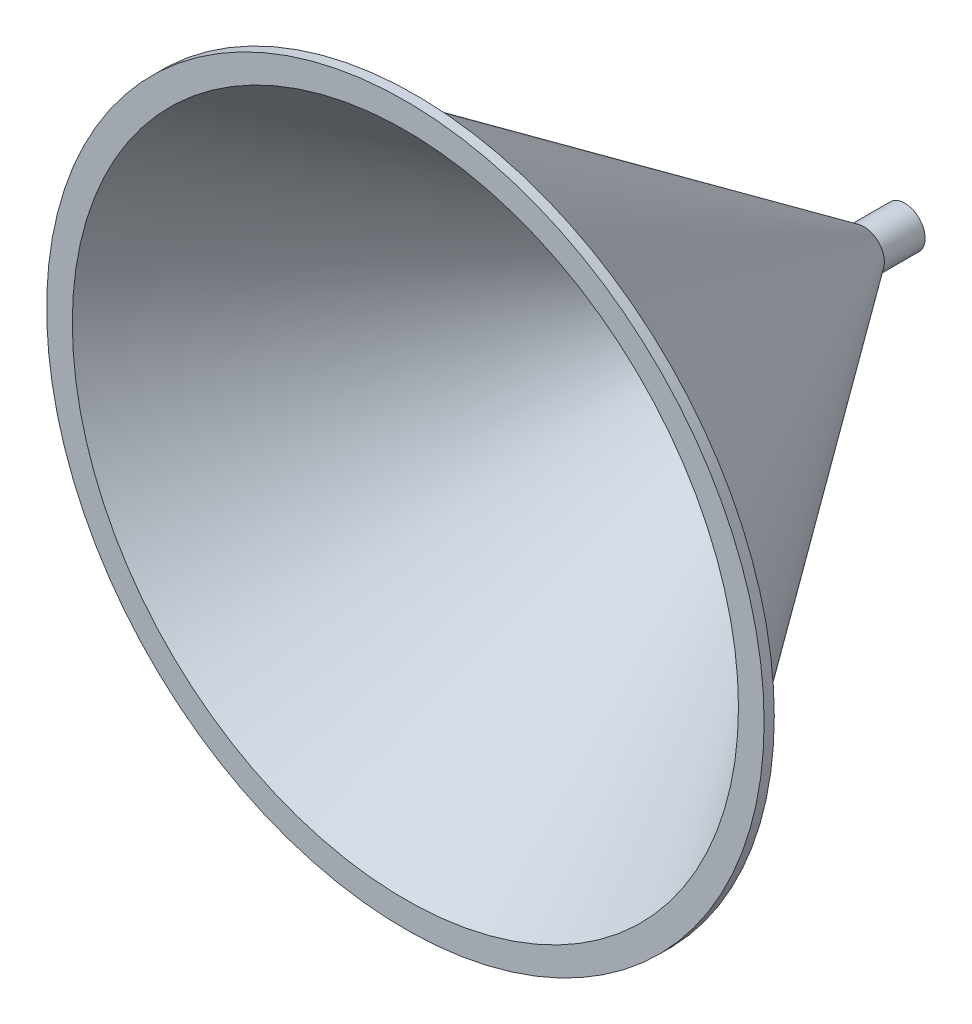
ISO-10303-21;
HEADER;
FILE_DESCRIPTION(('STEP AP214'),'2;1');
FILE_NAME('part.step','',(''),(''),'','','');
FILE_SCHEMA(('AUTOMOTIVE_DESIGN { 1 0 10303 214 1 1 1 1 }'));
ENDSEC;
DATA;
#1=APPLICATION_CONTEXT('core data for automotive mechanical design processes');
#2=APPLICATION_PROTOCOL_DEFINITION('international standard','automotive_design',2000,#1);
#3=PRODUCT_CONTEXT('',#1,'mechanical');
#4=PRODUCT('Part','Part','',(#3));
#5=PRODUCT_RELATED_PRODUCT_CATEGORY('part','',(#4));
#6=PRODUCT_DEFINITION_FORMATION('','',#4);
#7=PRODUCT_DEFINITION_CONTEXT('part definition',#1,'design');
#8=PRODUCT_DEFINITION('design','',#6,#7);
#9=PRODUCT_DEFINITION_SHAPE('','',#8);
#10=(LENGTH_UNIT() NAMED_UNIT(*) SI_UNIT(.MILLI.,.METRE.));
#11=(NAMED_UNIT(*) PLANE_ANGLE_UNIT() SI_UNIT($,.RADIAN.));
#12=(NAMED_UNIT(*) SI_UNIT($,.STERADIAN.) SOLID_ANGLE_UNIT());
#13=UNCERTAINTY_MEASURE_WITH_UNIT(LENGTH_MEASURE(1.E-05),#10,'distance_accuracy_value','');
#14=(GEOMETRIC_REPRESENTATION_CONTEXT(3) GLOBAL_UNCERTAINTY_ASSIGNED_CONTEXT((#13)) GLOBAL_UNIT_ASSIGNED_CONTEXT((#10,
#11,#12)) REPRESENTATION_CONTEXT('',''));
#15=CARTESIAN_POINT('',(0.,0.,0.));
#16=DIRECTION('',(0.,0.,1.));
#17=DIRECTION('',(1.,0.,0.));
#18=AXIS2_PLACEMENT_3D('',#15,#16,#17);
#19=CARTESIAN_POINT('',(0.,0.,-60.));
#20=DIRECTION('',(0.,0.,1.));
#21=DIRECTION('',(1.,0.,0.));
#22=AXIS2_PLACEMENT_3D('',#19,#20,#21);
#23=PLANE('',#22);
#24=CARTESIAN_POINT('',(0.,0.,-60.));
#25=DIRECTION('',(0.,0.,1.));
#26=DIRECTION('',(1.,0.,0.));
#27=AXIS2_PLACEMENT_3D('',#24,#25,#26);
#28=CIRCLE('',#27,2.5);
#29=CARTESIAN_POINT('',(2.49999999999998,0.,-60.));
#30=VERTEX_POINT('',#29);
#31=EDGE_CURVE('E52',#30,#30,#28,.T.);
#32=ORIENTED_EDGE('',*,*,#31,.T.);
#33=EDGE_LOOP('',(#32));
#34=FACE_BOUND('',#33,.T.);
#35=CARTESIAN_POINT('',(0.,0.,-60.));
#36=DIRECTION('',(0.,0.,1.));
#37=DIRECTION('',(1.,0.,0.));
#38=AXIS2_PLACEMENT_3D('',#35,#36,#37);
#39=CIRCLE('',#38,5.);
#40=CARTESIAN_POINT('',(4.99999999999998,0.,-60.));
#41=VERTEX_POINT('',#40);
#42=EDGE_CURVE('E10',#41,#41,#39,.T.);
#43=ORIENTED_EDGE('',*,*,#42,.F.);
#44=EDGE_LOOP('',(#43));
#45=FACE_BOUND('',#44,.T.);
#46=ADVANCED_FACE('F30',(#34,#45),#23,.F.);
#47=CARTESIAN_POINT('',(0.,0.,60.));
#48=DIRECTION('',(0.,0.,1.));
#49=DIRECTION('',(1.,0.,0.));
#50=AXIS2_PLACEMENT_3D('',#47,#48,#49);
#51=CYLINDRICAL_SURFACE('',#50,5.);
#52=CARTESIAN_POINT('',(0.,0.,-50.));
#53=DIRECTION('',(0.,0.,1.));
#54=DIRECTION('',(1.,0.,0.));
#55=AXIS2_PLACEMENT_3D('',#52,#53,#54);
#56=CIRCLE('',#55,5.);
#57=CARTESIAN_POINT('',(4.99999999999998,0.,-50.));
#58=VERTEX_POINT('',#57);
#59=EDGE_CURVE('E36',#58,#58,#56,.T.);
#60=ORIENTED_EDGE('',*,*,#59,.F.);
#61=EDGE_LOOP('',(#60));
#62=FACE_BOUND('',#61,.T.);
#63=ORIENTED_EDGE('',*,*,#42,.T.);
#64=EDGE_LOOP('',(#63));
#65=FACE_BOUND('',#64,.T.);
#66=ADVANCED_FACE('F76',(#62,#65),#51,.T.);
#67=CARTESIAN_POINT('',(0.,0.,-50.));
#68=DIRECTION('',(0.,0.,1.));
#69=DIRECTION('',(1.,0.,0.));
#70=AXIS2_PLACEMENT_3D('',#67,#68,#69);
#71=CONICAL_SURFACE('',#70,5.,0.616801223788019);
#72=CARTESIAN_POINT('',(0.,0.,60.));
#73=DIRECTION('',(0.,0.,1.));
#74=DIRECTION('',(1.,0.,0.));
#75=AXIS2_PLACEMENT_3D('',#72,#73,#74);
#76=CIRCLE('',#75,83.);
#77=CARTESIAN_POINT('',(83.,0.,60.));
#78=VERTEX_POINT('',#77);
#79=EDGE_CURVE('E40',#78,#78,#76,.T.);
#80=CARTESIAN_POINT('',(83.,0.,60.));
#81=CARTESIAN_POINT('',(82.1875,0.,58.8541666666666));
#82=CARTESIAN_POINT('',(81.375,0.,57.7083333333333));
#83=CARTESIAN_POINT('',(79.75,0.,55.4166666666666));
#84=CARTESIAN_POINT('',(78.9375,0.,54.2708333333333));
#85=CARTESIAN_POINT('',(77.3125,0.,51.9791666666666));
#86=CARTESIAN_POINT('',(76.5,0.,50.8333333333333));
#87=CARTESIAN_POINT('',(74.875,0.,48.5416666666666));
#88=CARTESIAN_POINT('',(74.0625,0.,47.3958333333333));
#89=CARTESIAN_POINT('',(72.4375,0.,45.1041666666666));
#90=CARTESIAN_POINT('',(71.625,0.,43.9583333333333));
#91=CARTESIAN_POINT('',(70.,0.,41.6666666666666));
#92=CARTESIAN_POINT('',(69.1875,0.,40.5208333333333));
#93=CARTESIAN_POINT('',(67.5625,0.,38.2291666666666));
#94=CARTESIAN_POINT('',(66.75,0.,37.0833333333333));
#95=CARTESIAN_POINT('',(65.125,0.,34.7916666666666));
#96=CARTESIAN_POINT('',(64.3125,0.,33.6458333333333));
#97=CARTESIAN_POINT('',(62.6875,0.,31.3541666666666));
#98=CARTESIAN_POINT('',(61.875,0.,30.2083333333333));
#99=CARTESIAN_POINT('',(60.25,0.,27.9166666666666));
#100=CARTESIAN_POINT('',(59.4375,0.,26.7708333333333));
#101=CARTESIAN_POINT('',(57.8125,0.,24.4791666666666));
#102=CARTESIAN_POINT('',(57.,0.,23.3333333333333));
#103=CARTESIAN_POINT('',(55.375,0.,21.0416666666666));
#104=CARTESIAN_POINT('',(54.5625,0.,19.8958333333333));
#105=CARTESIAN_POINT('',(52.9375,0.,17.6041666666666));
#106=CARTESIAN_POINT('',(52.125,0.,16.4583333333333));
#107=CARTESIAN_POINT('',(50.5,0.,14.1666666666666));
#108=CARTESIAN_POINT('',(49.6875,0.,13.0208333333333));
#109=CARTESIAN_POINT('',(48.0625,0.,10.7291666666666));
#110=CARTESIAN_POINT('',(47.25,0.,9.58333333333331));
#111=CARTESIAN_POINT('',(45.625,0.,7.29166666666665));
#112=CARTESIAN_POINT('',(44.8125,0.,6.14583333333332));
#113=CARTESIAN_POINT('',(43.1875,0.,3.85416666666665));
#114=CARTESIAN_POINT('',(42.375,0.,2.70833333333332));
#115=CARTESIAN_POINT('',(40.75,0.,0.416666666666652));
#116=CARTESIAN_POINT('',(39.9375,0.,-0.729166666666681));
#117=CARTESIAN_POINT('',(38.3125,0.,-3.02083333333335));
#118=CARTESIAN_POINT('',(37.5,0.,-4.16666666666668));
#119=CARTESIAN_POINT('',(35.875,0.,-6.45833333333335));
#120=CARTESIAN_POINT('',(35.0625,0.,-7.60416666666668));
#121=CARTESIAN_POINT('',(33.4375,0.,-9.89583333333335));
#122=CARTESIAN_POINT('',(32.625,0.,-11.0416666666667));
#123=CARTESIAN_POINT('',(31.,0.,-13.3333333333333));
#124=CARTESIAN_POINT('',(30.1875,0.,-14.4791666666667));
#125=CARTESIAN_POINT('',(28.5625,0.,-16.7708333333333));
#126=CARTESIAN_POINT('',(27.75,0.,-17.9166666666667));
#127=CARTESIAN_POINT('',(26.125,0.,-20.2083333333333));
#128=CARTESIAN_POINT('',(25.3125,0.,-21.3541666666667));
#129=CARTESIAN_POINT('',(23.6875,0.,-23.6458333333333));
#130=CARTESIAN_POINT('',(22.875,0.,-24.7916666666667));
#131=CARTESIAN_POINT('',(21.25,0.,-27.0833333333333));
#132=CARTESIAN_POINT('',(20.4375,0.,-28.2291666666667));
#133=CARTESIAN_POINT('',(18.8125,0.,-30.5208333333333));
#134=CARTESIAN_POINT('',(18.,0.,-31.6666666666667));
#135=CARTESIAN_POINT('',(16.375,0.,-33.9583333333333));
#136=CARTESIAN_POINT('',(15.5625,0.,-35.1041666666667));
#137=CARTESIAN_POINT('',(13.9375,0.,-37.3958333333333));
#138=CARTESIAN_POINT('',(13.125,0.,-38.5416666666667));
#139=CARTESIAN_POINT('',(11.5,0.,-40.8333333333333));
#140=CARTESIAN_POINT('',(10.6875,0.,-41.9791666666667));
#141=CARTESIAN_POINT('',(9.06249999999998,0.,-44.2708333333333));
#142=CARTESIAN_POINT('',(8.24999999999998,0.,-45.4166666666667));
#143=CARTESIAN_POINT('',(6.62499999999998,0.,-47.7083333333333));
#144=CARTESIAN_POINT('',(5.81249999999998,0.,-48.8541666666667));
#145=CARTESIAN_POINT('',(4.99999999999998,0.,-50.));
#146=B_SPLINE_CURVE_WITH_KNOTS('',3,(#80,#81,#82,#83,#84,#85,#86,#87,#88,#89,#90,#91,#92,#93,
#94,#95,#96,#97,#98,#99,#100,#101,#102,#103,#104,#105,#106,#107,#108,#109,#110,#111,#112,#113,
#114,#115,#116,#117,#118,#119,#120,#121,#122,#123,#124,#125,#126,#127,#128,#129,#130,#131,#132,
#133,#134,#135,#136,#137,#138,#139,#140,#141,#142,#143,#144,#145),.UNSPECIFIED.,.F.,.F.,(4,2,2,
2,2,2,2,2,2,2,2,2,2,2,2,2,2,2,2,2,2,2,2,2,2,2,2,2,2,2,2,2,4),(0.,4.21400195775939,
8.42800391551878,12.6420058732782,16.8560078310376,21.070009788797,25.2840117465564,
29.4980137043157,33.7120156620752,37.9260176198345,42.1400195775939,46.3540215353533,
50.5680234931127,54.7820254508721,58.9960274086315,63.2100293663909,67.4240313241503,
71.6380332819097,75.8520352396691,80.0660371974285,84.2800391551879,88.4940411129473,
92.7080430707067,96.922045028466,101.136046986225,105.350048943985,109.564050901744,
113.778052859504,117.992054817263,122.206056775022,126.420058732782,130.634060690541,
134.848062648301),.UNSPECIFIED.);
#147=EDGE_CURVE('BSEAM81',#78,#58,#146,.T.);
#148=ORIENTED_EDGE('',*,*,#79,.F.);
#149=ORIENTED_EDGE('',*,*,#59,.T.);
#150=ORIENTED_EDGE('',*,*,#147,.T.);
#151=ORIENTED_EDGE('',*,*,#147,.F.);
#152=EDGE_LOOP('',(#148,#150,#149,#151));
#153=FACE_BOUND('',#152,.T.);
#154=ADVANCED_FACE('F81',(#153),#71,.T.);
#155=CARTESIAN_POINT('',(-83.,0.,60.));
#156=DIRECTION('',(0.,0.,1.));
#157=DIRECTION('',(1.,0.,0.));
#158=AXIS2_PLACEMENT_3D('',#155,#156,#157);
#159=PLANE('',#158);
#160=CARTESIAN_POINT('',(0.,0.,60.));
#161=DIRECTION('',(0.,0.,1.));
#162=DIRECTION('',(1.,0.,0.));
#163=AXIS2_PLACEMENT_3D('',#160,#161,#162);
#164=CIRCLE('',#163,88.);
#165=CARTESIAN_POINT('',(88.,0.,60.));
#166=VERTEX_POINT('',#165);
#167=EDGE_CURVE('E44',#166,#166,#164,.T.);
#168=ORIENTED_EDGE('',*,*,#167,.F.);
#169=EDGE_LOOP('',(#168));
#170=FACE_BOUND('',#169,.T.);
#171=ORIENTED_EDGE('',*,*,#79,.T.);
#172=EDGE_LOOP('',(#171));
#173=FACE_BOUND('',#172,.T.);
#174=ADVANCED_FACE('F88',(#170,#173),#159,.F.);
#175=CARTESIAN_POINT('',(0.,0.,60.));
#176=DIRECTION('',(0.,0.,1.));
#177=DIRECTION('',(1.,0.,0.));
#178=AXIS2_PLACEMENT_3D('',#175,#176,#177);
#179=CYLINDRICAL_SURFACE('',#178,88.);
#180=CARTESIAN_POINT('',(0.,0.,62.5));
#181=DIRECTION('',(0.,0.,1.));
#182=DIRECTION('',(1.,0.,0.));
#183=AXIS2_PLACEMENT_3D('',#180,#181,#182);
#184=CIRCLE('',#183,88.);
#185=CARTESIAN_POINT('',(88.,0.,62.5));
#186=VERTEX_POINT('',#185);
#187=EDGE_CURVE('E49',#186,#186,#184,.T.);
#188=ORIENTED_EDGE('',*,*,#187,.F.);
#189=EDGE_LOOP('',(#188));
#190=FACE_BOUND('',#189,.T.);
#191=ORIENTED_EDGE('',*,*,#167,.T.);
#192=EDGE_LOOP('',(#191));
#193=FACE_BOUND('',#192,.T.);
#194=ADVANCED_FACE('F94',(#190,#193),#179,.T.);
#195=CARTESIAN_POINT('',(-88.,0.,62.5));
#196=DIRECTION('',(0.,0.,-1.));
#197=DIRECTION('',(-1.,0.,0.));
#198=AXIS2_PLACEMENT_3D('',#195,#196,#197);
#199=PLANE('',#198);
#200=CARTESIAN_POINT('',(0.,0.,62.5));
#201=DIRECTION('',(0.,0.,1.));
#202=DIRECTION('',(1.,0.,0.));
#203=AXIS2_PLACEMENT_3D('',#200,#201,#202);
#204=CIRCLE('',#203,81.707998576175);
#205=CARTESIAN_POINT('',(81.707998576175,0.,62.5));
#206=VERTEX_POINT('',#205);
#207=EDGE_CURVE('E56',#206,#206,#204,.T.);
#208=ORIENTED_EDGE('',*,*,#207,.F.);
#209=EDGE_LOOP('',(#208));
#210=FACE_BOUND('',#209,.T.);
#211=ORIENTED_EDGE('',*,*,#187,.T.);
#212=EDGE_LOOP('',(#211));
#213=FACE_BOUND('',#212,.T.);
#214=ADVANCED_FACE('F72',(#210,#213),#199,.F.);
#215=CARTESIAN_POINT('',(0.,0.,60.));
#216=DIRECTION('',(0.,0.,1.));
#217=DIRECTION('',(1.,0.,0.));
#218=AXIS2_PLACEMENT_3D('',#215,#216,#217);
#219=CYLINDRICAL_SURFACE('',#218,2.5);
#220=CARTESIAN_POINT('',(0.,0.,-49.2035877356314));
#221=DIRECTION('',(0.,0.,1.));
#222=DIRECTION('',(1.,0.,0.));
#223=AXIS2_PLACEMENT_3D('',#220,#221,#222);
#224=CIRCLE('',#223,2.5);
#225=CARTESIAN_POINT('',(2.49999999999998,0.,-49.2035877356314));
#226=VERTEX_POINT('',#225);
#227=EDGE_CURVE('E55',#226,#226,#224,.T.);
#228=ORIENTED_EDGE('',*,*,#227,.T.);
#229=EDGE_LOOP('',(#228));
#230=FACE_BOUND('',#229,.T.);
#231=ORIENTED_EDGE('',*,*,#31,.F.);
#232=EDGE_LOOP('',(#231));
#233=FACE_BOUND('',#232,.T.);
#234=ADVANCED_FACE('F62',(#230,#233),#219,.F.);
#235=CARTESIAN_POINT('',(0.,0.,-48.5539280567302));
#236=DIRECTION('',(0.,0.,1.));
#237=DIRECTION('',(1.,0.,0.));
#238=AXIS2_PLACEMENT_3D('',#235,#236,#237);
#239=CONICAL_SURFACE('',#238,2.96066777231178,0.616801223788019);
#240=CARTESIAN_POINT('',(81.707998576175,0.,62.5));
#241=CARTESIAN_POINT('',(80.8829152576731,0.,61.3364209610871));
#242=CARTESIAN_POINT('',(80.0578319391713,0.,60.1728419221743));
#243=CARTESIAN_POINT('',(78.4076653021677,0.,57.8456838443487));
#244=CARTESIAN_POINT('',(77.5825819836659,0.,56.6821048054358));
#245=CARTESIAN_POINT('',(75.9324153466622,0.,54.3549467276102));
#246=CARTESIAN_POINT('',(75.1073320281604,0.,53.1913676886974));
#247=CARTESIAN_POINT('',(73.4571653911567,0.,50.8642096108717));
#248=CARTESIAN_POINT('',(72.6320820726549,0.,49.7006305719589));
#249=CARTESIAN_POINT('',(70.9819154356513,0.,47.3734724941332));
#250=CARTESIAN_POINT('',(70.1568321171495,0.,46.2098934552204));
#251=CARTESIAN_POINT('',(68.5066654801458,0.,43.8827353773947));
#252=CARTESIAN_POINT('',(67.681582161644,0.,42.7191563384819));
#253=CARTESIAN_POINT('',(66.0314155246403,0.,40.3919982606563));
#254=CARTESIAN_POINT('',(65.2063322061385,0.,39.2284192217434));
#255=CARTESIAN_POINT('',(63.5561655691349,0.,36.9012611439178));
#256=CARTESIAN_POINT('',(62.7310822506331,0.,35.737682105005));
#257=CARTESIAN_POINT('',(61.0809156136294,0.,33.4105240271793));
#258=CARTESIAN_POINT('',(60.2558322951276,0.,32.2469449882665));
#259=CARTESIAN_POINT('',(58.6056656581239,0.,29.9197869104408));
#260=CARTESIAN_POINT('',(57.7805823396221,0.,28.756207871528));
#261=CARTESIAN_POINT('',(56.1304157026185,0.,26.4290497937024));
#262=CARTESIAN_POINT('',(55.3053323841167,0.,25.2654707547895));
#263=CARTESIAN_POINT('',(53.655165747113,0.,22.9383126769639));
#264=CARTESIAN_POINT('',(52.8300824286112,0.,21.774733638051));
#265=CARTESIAN_POINT('',(51.1799157916075,0.,19.4475755602254));
#266=CARTESIAN_POINT('',(50.3548324731057,0.,18.2839965213126));
#267=CARTESIAN_POINT('',(48.7046658361021,0.,15.9568384434869));
#268=CARTESIAN_POINT('',(47.8795825176002,0.,14.7932594045741));
#269=CARTESIAN_POINT('',(46.2294158805966,0.,12.4661013267484));
#270=CARTESIAN_POINT('',(45.4043325620948,0.,11.3025222878356));
#271=CARTESIAN_POINT('',(43.7541659250911,0.,8.97536421000995));
#272=CARTESIAN_POINT('',(42.9290826065893,0.,7.81178517109712));
#273=CARTESIAN_POINT('',(41.2789159695857,0.,5.48462709327147));
#274=CARTESIAN_POINT('',(40.4538326510838,0.,4.32104805435864));
#275=CARTESIAN_POINT('',(38.8036660140802,0.,1.99388997653299));
#276=CARTESIAN_POINT('',(37.9785826955784,0.,0.830310937620166));
#277=CARTESIAN_POINT('',(36.3284160585747,0.,-1.49684714020549));
#278=CARTESIAN_POINT('',(35.5033327400729,0.,-2.66042617911832));
#279=CARTESIAN_POINT('',(33.8531661030692,0.,-4.98758425694397));
#280=CARTESIAN_POINT('',(33.0280827845674,0.,-6.1511632958568));
#281=CARTESIAN_POINT('',(31.3779161475638,0.,-8.47832137368245));
#282=CARTESIAN_POINT('',(30.552832829062,0.,-9.64190041259528));
#283=CARTESIAN_POINT('',(28.9026661920583,0.,-11.9690584904209));
#284=CARTESIAN_POINT('',(28.0775828735565,0.,-13.1326375293338));
#285=CARTESIAN_POINT('',(26.4274162365528,0.,-15.4597956071594));
#286=CARTESIAN_POINT('',(25.602332918051,0.,-16.6233746460722));
#287=CARTESIAN_POINT('',(23.9521662810474,0.,-18.9505327238979));
#288=CARTESIAN_POINT('',(23.1270829625456,0.,-20.1141117628107));
#289=CARTESIAN_POINT('',(21.4769163255419,0.,-22.4412698406364));
#290=CARTESIAN_POINT('',(20.6518330070401,0.,-23.6048488795492));
#291=CARTESIAN_POINT('',(19.0016663700364,0.,-25.9320069573749));
#292=CARTESIAN_POINT('',(18.1765830515346,0.,-27.0955859962877));
#293=CARTESIAN_POINT('',(16.526416414531,0.,-29.4227440741133));
#294=CARTESIAN_POINT('',(15.7013330960291,0.,-30.5863231130262));
#295=CARTESIAN_POINT('',(14.0511664590255,0.,-32.9134811908518));
#296=CARTESIAN_POINT('',(13.2260831405237,0.,-34.0770602297646));
#297=CARTESIAN_POINT('',(11.57591650352,0.,-36.4042183075903));
#298=CARTESIAN_POINT('',(10.7508331850182,0.,-37.5677973465031));
#299=CARTESIAN_POINT('',(9.10066654801456,0.,-39.8949554243288));
#300=CARTESIAN_POINT('',(8.27558322951274,0.,-41.0585344632416));
#301=CARTESIAN_POINT('',(6.62541659250909,0.,-43.3856925410673));
#302=CARTESIAN_POINT('',(5.80033327400727,0.,-44.5492715799801));
#303=CARTESIAN_POINT('',(4.15016663700362,0.,-46.8764296578057));
#304=CARTESIAN_POINT('',(3.3250833185018,0.,-48.0400086967186));
#305=CARTESIAN_POINT('',(2.49999999999998,0.,-49.2035877356314));
#306=B_SPLINE_CURVE_WITH_KNOTS('',3,(#240,#241,#242,#243,#244,#245,#246,#247,#248,#249,#250,
#251,#252,#253,#254,#255,#256,#257,#258,#259,#260,#261,#262,#263,#264,#265,#266,#267,#268,#269,
#270,#271,#272,#273,#274,#275,#276,#277,#278,#279,#280,#281,#282,#283,#284,#285,#286,#287,#288,
#289,#290,#291,#292,#293,#294,#295,#296,#297,#298,#299,#300,#301,#302,#303,#304,#305),
.UNSPECIFIED.,.F.,.F.,(4,2,2,2,2,2,2,2,2,2,2,2,2,2,2,2,2,2,2,2,2,2,2,2,2,2,2,2,2,2,2,2,4),(0.,
4.27926488551544,8.55852977103088,12.8377946565463,17.1170595420618,21.3963244275772,
25.6755893130927,29.9548541986081,34.2341190841235,38.513383969639,42.7926488551544,
47.0719137406699,51.3511786261853,55.6304435117008,59.9097083972162,64.1889732827316,
68.4682381682471,72.7475030537625,77.026767939278,81.3060328247934,85.5852977103089,
89.8645625958243,94.1438274813397,98.4230923668552,102.702357252371,106.981622137886,
111.260887023402,115.540151908917,119.819416794432,124.098681679948,128.377946565463,
132.657211450979,136.936476336494),.UNSPECIFIED.);
#307=EDGE_CURVE('BSEAM65',#206,#226,#306,.T.);
#308=ORIENTED_EDGE('',*,*,#207,.T.);
#309=ORIENTED_EDGE('',*,*,#227,.F.);
#310=ORIENTED_EDGE('',*,*,#307,.T.);
#311=ORIENTED_EDGE('',*,*,#307,.F.);
#312=EDGE_LOOP('',(#308,#310,#309,#311));
#313=FACE_BOUND('',#312,.T.);
#314=ADVANCED_FACE('F65',(#313),#239,.F.);
#315=CLOSED_SHELL('',(#46,#66,#154,#174,#194,#214,#234,#314));
#316=MANIFOLD_SOLID_BREP('B2',#315);
#317=ADVANCED_BREP_SHAPE_REPRESENTATION('',(#18,#316),#14);
#318=SHAPE_DEFINITION_REPRESENTATION(#9,#317);
ENDSEC;
END-ISO-10303-21;
